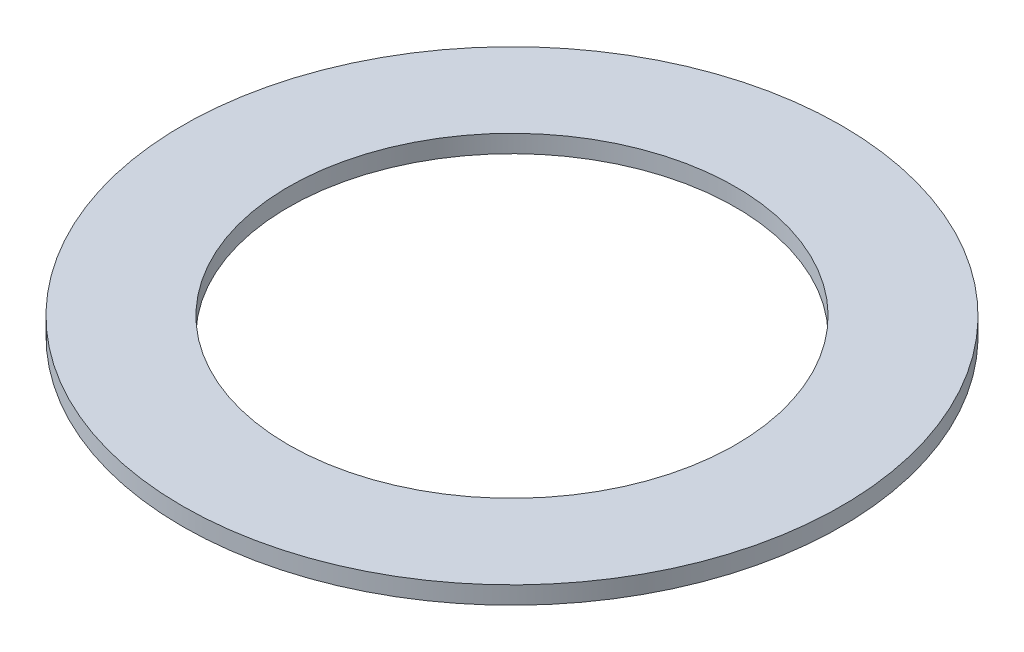
ISO-10303-21;
HEADER;
FILE_DESCRIPTION(('STEP AP214'),'2;1');
FILE_NAME('part.step','',(''),(''),'','','');
FILE_SCHEMA(('AUTOMOTIVE_DESIGN { 1 0 10303 214 1 1 1 1 }'));
ENDSEC;
DATA;
#1=APPLICATION_CONTEXT('core data for automotive mechanical design processes');
#2=APPLICATION_PROTOCOL_DEFINITION('international standard','automotive_design',2000,#1);
#3=PRODUCT_CONTEXT('',#1,'mechanical');
#4=PRODUCT('Part','Part','',(#3));
#5=PRODUCT_RELATED_PRODUCT_CATEGORY('part','',(#4));
#6=PRODUCT_DEFINITION_FORMATION('','',#4);
#7=PRODUCT_DEFINITION_CONTEXT('part definition',#1,'design');
#8=PRODUCT_DEFINITION('design','',#6,#7);
#9=PRODUCT_DEFINITION_SHAPE('','',#8);
#10=(LENGTH_UNIT() NAMED_UNIT(*) SI_UNIT(.MILLI.,.METRE.));
#11=(NAMED_UNIT(*) PLANE_ANGLE_UNIT() SI_UNIT($,.RADIAN.));
#12=(NAMED_UNIT(*) SI_UNIT($,.STERADIAN.) SOLID_ANGLE_UNIT());
#13=UNCERTAINTY_MEASURE_WITH_UNIT(LENGTH_MEASURE(1.E-05),#10,'distance_accuracy_value','');
#14=(GEOMETRIC_REPRESENTATION_CONTEXT(3) GLOBAL_UNCERTAINTY_ASSIGNED_CONTEXT((#13)) GLOBAL_UNIT_ASSIGNED_CONTEXT((#10,
#11,#12)) REPRESENTATION_CONTEXT('',''));
#15=CARTESIAN_POINT('',(0.,0.,0.));
#16=DIRECTION('',(0.,0.,1.));
#17=DIRECTION('',(1.,0.,0.));
#18=AXIS2_PLACEMENT_3D('',#15,#16,#17);
#19=CARTESIAN_POINT('',(0.,0.127,0.));
#20=DIRECTION('',(0.,1.,0.));
#21=DIRECTION('',(0.,0.,1.));
#22=AXIS2_PLACEMENT_3D('',#19,#20,#21);
#23=PLANE('',#22);
#24=CARTESIAN_POINT('',(0.,0.127,0.));
#25=DIRECTION('',(0.,1.,0.));
#26=DIRECTION('',(0.,0.,1.));
#27=AXIS2_PLACEMENT_3D('',#24,#25,#26);
#28=CIRCLE('',#27,4.7371);
#29=CARTESIAN_POINT('',(0.,0.127,4.7371));
#30=VERTEX_POINT('',#29);
#31=EDGE_CURVE('E10',#30,#30,#28,.T.);
#32=ORIENTED_EDGE('',*,*,#31,.T.);
#33=EDGE_LOOP('',(#32));
#34=FACE_BOUND('',#33,.T.);
#35=CARTESIAN_POINT('',(0.,0.127,0.));
#36=DIRECTION('',(0.,1.,0.));
#37=DIRECTION('',(0.,0.,1.));
#38=AXIS2_PLACEMENT_3D('',#35,#36,#37);
#39=CIRCLE('',#38,3.2131);
#40=CARTESIAN_POINT('',(0.,0.127,3.2131));
#41=VERTEX_POINT('',#40);
#42=EDGE_CURVE('E43',#41,#41,#39,.T.);
#43=ORIENTED_EDGE('',*,*,#42,.F.);
#44=EDGE_LOOP('',(#43));
#45=FACE_BOUND('',#44,.T.);
#46=ADVANCED_FACE('F32',(#34,#45),#23,.T.);
#47=CARTESIAN_POINT('',(0.,-0.127,0.));
#48=DIRECTION('',(0.,1.,0.));
#49=DIRECTION('',(0.,0.,1.));
#50=AXIS2_PLACEMENT_3D('',#47,#48,#49);
#51=PLANE('',#50);
#52=CARTESIAN_POINT('',(0.,-0.127,0.));
#53=DIRECTION('',(0.,1.,0.));
#54=DIRECTION('',(0.,0.,1.));
#55=AXIS2_PLACEMENT_3D('',#52,#53,#54);
#56=CIRCLE('',#55,4.7371);
#57=CARTESIAN_POINT('',(0.,-0.127,4.7371));
#58=VERTEX_POINT('',#57);
#59=EDGE_CURVE('E36',#58,#58,#56,.T.);
#60=ORIENTED_EDGE('',*,*,#59,.F.);
#61=EDGE_LOOP('',(#60));
#62=FACE_BOUND('',#61,.T.);
#63=CARTESIAN_POINT('',(0.,-0.127,0.));
#64=DIRECTION('',(0.,1.,0.));
#65=DIRECTION('',(0.,0.,1.));
#66=AXIS2_PLACEMENT_3D('',#63,#64,#65);
#67=CIRCLE('',#66,3.2131);
#68=CARTESIAN_POINT('',(0.,-0.127,3.2131));
#69=VERTEX_POINT('',#68);
#70=EDGE_CURVE('E45',#69,#69,#67,.T.);
#71=ORIENTED_EDGE('',*,*,#70,.T.);
#72=EDGE_LOOP('',(#71));
#73=FACE_BOUND('',#72,.T.);
#74=ADVANCED_FACE('F55',(#62,#73),#51,.F.);
#75=CARTESIAN_POINT('',(0.,0.127,0.));
#76=DIRECTION('',(0.,-1.,0.));
#77=DIRECTION('',(0.,0.,-1.));
#78=AXIS2_PLACEMENT_3D('',#75,#76,#77);
#79=CYLINDRICAL_SURFACE('',#78,4.7371);
#80=ORIENTED_EDGE('',*,*,#31,.F.);
#81=EDGE_LOOP('',(#80));
#82=FACE_BOUND('',#81,.T.);
#83=ORIENTED_EDGE('',*,*,#59,.T.);
#84=EDGE_LOOP('',(#83));
#85=FACE_BOUND('',#84,.T.);
#86=ADVANCED_FACE('F34',(#82,#85),#79,.T.);
#87=CARTESIAN_POINT('',(0.,0.127,0.));
#88=DIRECTION('',(0.,-1.,0.));
#89=DIRECTION('',(0.,0.,-1.));
#90=AXIS2_PLACEMENT_3D('',#87,#88,#89);
#91=CYLINDRICAL_SURFACE('',#90,3.2131);
#92=ORIENTED_EDGE('',*,*,#42,.T.);
#93=EDGE_LOOP('',(#92));
#94=FACE_BOUND('',#93,.T.);
#95=ORIENTED_EDGE('',*,*,#70,.F.);
#96=EDGE_LOOP('',(#95));
#97=FACE_BOUND('',#96,.T.);
#98=ADVANCED_FACE('F51',(#94,#97),#91,.F.);
#99=CLOSED_SHELL('',(#46,#74,#86,#98));
#100=MANIFOLD_SOLID_BREP('B2',#99);
#101=ADVANCED_BREP_SHAPE_REPRESENTATION('',(#18,#100),#14);
#102=SHAPE_DEFINITION_REPRESENTATION(#9,#101);
ENDSEC;
END-ISO-10303-21;
